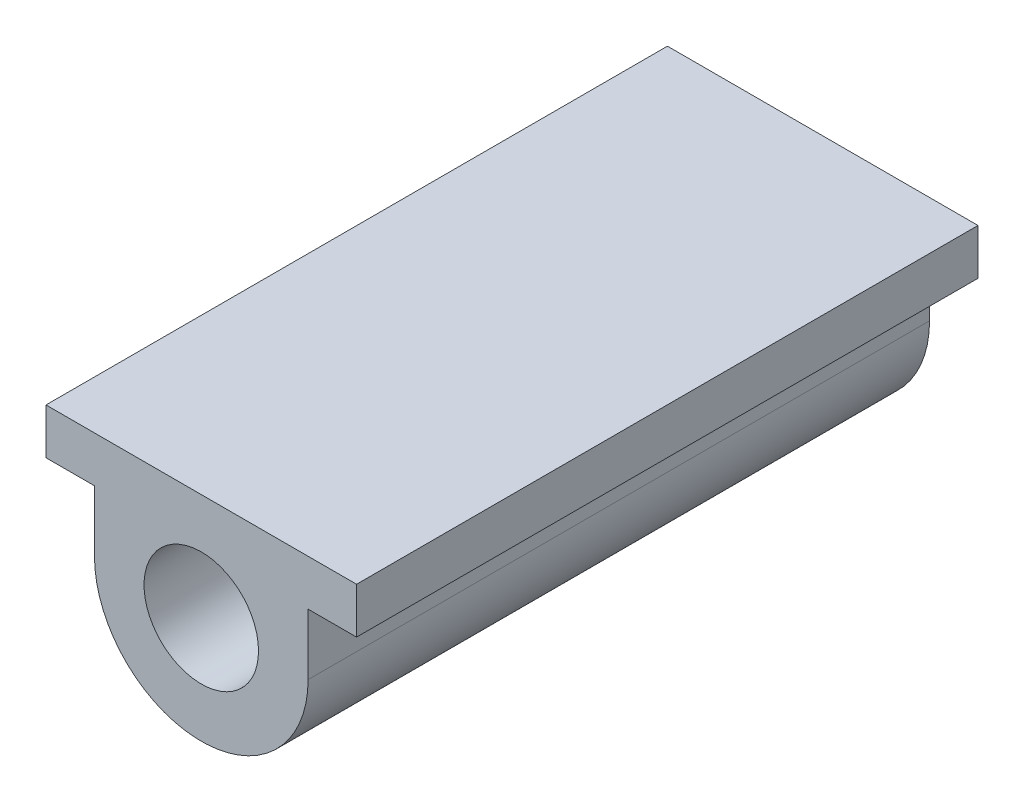
ISO-10303-21;
HEADER;
FILE_DESCRIPTION(('STEP AP214'),'2;1');
FILE_NAME('part.step','',(''),(''),'','','');
FILE_SCHEMA(('AUTOMOTIVE_DESIGN { 1 0 10303 214 1 1 1 1 }'));
ENDSEC;
DATA;
#1=APPLICATION_CONTEXT('core data for automotive mechanical design processes');
#2=APPLICATION_PROTOCOL_DEFINITION('international standard','automotive_design',2000,#1);
#3=PRODUCT_CONTEXT('',#1,'mechanical');
#4=PRODUCT('Part','Part','',(#3));
#5=PRODUCT_RELATED_PRODUCT_CATEGORY('part','',(#4));
#6=PRODUCT_DEFINITION_FORMATION('','',#4);
#7=PRODUCT_DEFINITION_CONTEXT('part definition',#1,'design');
#8=PRODUCT_DEFINITION('design','',#6,#7);
#9=PRODUCT_DEFINITION_SHAPE('','',#8);
#10=(LENGTH_UNIT() NAMED_UNIT(*) SI_UNIT(.MILLI.,.METRE.));
#11=(NAMED_UNIT(*) PLANE_ANGLE_UNIT() SI_UNIT($,.RADIAN.));
#12=(NAMED_UNIT(*) SI_UNIT($,.STERADIAN.) SOLID_ANGLE_UNIT());
#13=UNCERTAINTY_MEASURE_WITH_UNIT(LENGTH_MEASURE(1.E-05),#10,'distance_accuracy_value','');
#14=(GEOMETRIC_REPRESENTATION_CONTEXT(3) GLOBAL_UNCERTAINTY_ASSIGNED_CONTEXT((#13)) GLOBAL_UNIT_ASSIGNED_CONTEXT((#10,
#11,#12)) REPRESENTATION_CONTEXT('',''));
#15=CARTESIAN_POINT('',(0.,0.,0.));
#16=DIRECTION('',(0.,0.,1.));
#17=DIRECTION('',(1.,0.,0.));
#18=AXIS2_PLACEMENT_3D('',#15,#16,#17);
#19=CARTESIAN_POINT('',(0.,0.,81.44));
#20=DIRECTION('',(0.,0.,-1.));
#21=DIRECTION('',(-1.,0.,0.));
#22=AXIS2_PLACEMENT_3D('',#19,#20,#21);
#23=PLANE('',#22);
#24=DIRECTION('',(0.,-1.,0.));
#25=VECTOR('',#24,1.);
#26=CARTESIAN_POINT('',(-20.35,14.,81.44));
#27=LINE('',#26,#25);
#28=CARTESIAN_POINT('',(-20.35,14.,81.44));
#29=VERTEX_POINT('',#28);
#30=CARTESIAN_POINT('',(-20.35,8.,81.44));
#31=VERTEX_POINT('',#30);
#32=EDGE_CURVE('E147',#29,#31,#27,.T.);
#33=ORIENTED_EDGE('',*,*,#32,.T.);
#34=DIRECTION('',(1.,0.,0.));
#35=VECTOR('',#34,1.);
#36=CARTESIAN_POINT('',(-20.35,8.,81.44));
#37=LINE('',#36,#35);
#38=CARTESIAN_POINT('',(-14.,8.,81.44));
#39=VERTEX_POINT('',#38);
#40=EDGE_CURVE('E95',#31,#39,#37,.T.);
#41=ORIENTED_EDGE('',*,*,#40,.T.);
#42=DIRECTION('',(0.,-1.,0.));
#43=VECTOR('',#42,1.);
#44=CARTESIAN_POINT('',(-14.,8.,81.44));
#45=LINE('',#44,#43);
#46=CARTESIAN_POINT('',(-14.,0.,81.44));
#47=VERTEX_POINT('',#46);
#48=EDGE_CURVE('E162',#39,#47,#45,.T.);
#49=ORIENTED_EDGE('',*,*,#48,.T.);
#50=CARTESIAN_POINT('',(0.,0.,81.44));
#51=DIRECTION('',(0.,0.,1.));
#52=DIRECTION('',(-1.,0.,0.));
#53=AXIS2_PLACEMENT_3D('',#50,#51,#52);
#54=CIRCLE('',#53,14.);
#55=CARTESIAN_POINT('',(14.,0.,81.44));
#56=VERTEX_POINT('',#55);
#57=EDGE_CURVE('E175',#47,#56,#54,.T.);
#58=ORIENTED_EDGE('',*,*,#57,.T.);
#59=DIRECTION('',(0.,1.,0.));
#60=VECTOR('',#59,1.);
#61=CARTESIAN_POINT('',(14.,8.,81.44));
#62=LINE('',#61,#60);
#63=CARTESIAN_POINT('',(14.,8.,81.44));
#64=VERTEX_POINT('',#63);
#65=EDGE_CURVE('E114',#56,#64,#62,.T.);
#66=ORIENTED_EDGE('',*,*,#65,.T.);
#67=DIRECTION('',(1.,0.,0.));
#68=VECTOR('',#67,1.);
#69=CARTESIAN_POINT('',(20.35,8.,81.44));
#70=LINE('',#69,#68);
#71=CARTESIAN_POINT('',(20.35,8.,81.44));
#72=VERTEX_POINT('',#71);
#73=EDGE_CURVE('E108',#64,#72,#70,.T.);
#74=ORIENTED_EDGE('',*,*,#73,.T.);
#75=DIRECTION('',(0.,1.,0.));
#76=VECTOR('',#75,1.);
#77=CARTESIAN_POINT('',(20.35,14.,81.44));
#78=LINE('',#77,#76);
#79=CARTESIAN_POINT('',(20.35,14.,81.44));
#80=VERTEX_POINT('',#79);
#81=EDGE_CURVE('E112',#72,#80,#78,.T.);
#82=ORIENTED_EDGE('',*,*,#81,.T.);
#83=DIRECTION('',(-1.,0.,0.));
#84=VECTOR('',#83,1.);
#85=CARTESIAN_POINT('',(-20.35,14.,81.44));
#86=LINE('',#85,#84);
#87=EDGE_CURVE('E52',#80,#29,#86,.T.);
#88=ORIENTED_EDGE('',*,*,#87,.T.);
#89=EDGE_LOOP('',(#33,#41,#49,#58,#66,#74,#82,#88));
#90=FACE_BOUND('',#89,.T.);
#91=CARTESIAN_POINT('',(0.,0.,81.44));
#92=DIRECTION('',(0.,0.,1.));
#93=DIRECTION('',(1.,0.,0.));
#94=AXIS2_PLACEMENT_3D('',#91,#92,#93);
#95=CIRCLE('',#94,7.5);
#96=CARTESIAN_POINT('',(7.5,0.,81.44));
#97=VERTEX_POINT('',#96);
#98=EDGE_CURVE('E136',#97,#97,#95,.T.);
#99=ORIENTED_EDGE('',*,*,#98,.F.);
#100=EDGE_LOOP('',(#99));
#101=FACE_BOUND('',#100,.T.);
#102=ADVANCED_FACE('F35',(#90,#101),#23,.F.);
#103=CARTESIAN_POINT('',(0.,0.,0.));
#104=DIRECTION('',(0.,0.,-1.));
#105=DIRECTION('',(-1.,0.,0.));
#106=AXIS2_PLACEMENT_3D('',#103,#104,#105);
#107=PLANE('',#106);
#108=DIRECTION('',(0.,-1.,0.));
#109=VECTOR('',#108,1.);
#110=CARTESIAN_POINT('',(-20.35,14.,0.));
#111=LINE('',#110,#109);
#112=CARTESIAN_POINT('',(-20.35,14.,0.));
#113=VERTEX_POINT('',#112);
#114=CARTESIAN_POINT('',(-20.35,8.,0.));
#115=VERTEX_POINT('',#114);
#116=EDGE_CURVE('E132',#113,#115,#111,.T.);
#117=ORIENTED_EDGE('',*,*,#116,.F.);
#118=DIRECTION('',(-1.,0.,0.));
#119=VECTOR('',#118,1.);
#120=CARTESIAN_POINT('',(-20.35,14.,0.));
#121=LINE('',#120,#119);
#122=CARTESIAN_POINT('',(20.35,14.,0.));
#123=VERTEX_POINT('',#122);
#124=EDGE_CURVE('E87',#123,#113,#121,.T.);
#125=ORIENTED_EDGE('',*,*,#124,.F.);
#126=DIRECTION('',(0.,1.,0.));
#127=VECTOR('',#126,1.);
#128=CARTESIAN_POINT('',(20.35,14.,0.));
#129=LINE('',#128,#127);
#130=CARTESIAN_POINT('',(20.35,8.,0.));
#131=VERTEX_POINT('',#130);
#132=EDGE_CURVE('E81',#131,#123,#129,.T.);
#133=ORIENTED_EDGE('',*,*,#132,.F.);
#134=DIRECTION('',(1.,0.,0.));
#135=VECTOR('',#134,1.);
#136=CARTESIAN_POINT('',(20.35,8.,0.));
#137=LINE('',#136,#135);
#138=CARTESIAN_POINT('',(14.,8.,0.));
#139=VERTEX_POINT('',#138);
#140=EDGE_CURVE('E122',#139,#131,#137,.T.);
#141=ORIENTED_EDGE('',*,*,#140,.F.);
#142=DIRECTION('',(0.,1.,0.));
#143=VECTOR('',#142,1.);
#144=CARTESIAN_POINT('',(14.,8.,0.));
#145=LINE('',#144,#143);
#146=CARTESIAN_POINT('',(14.,0.,0.));
#147=VERTEX_POINT('',#146);
#148=EDGE_CURVE('E142',#147,#139,#145,.T.);
#149=ORIENTED_EDGE('',*,*,#148,.F.);
#150=CARTESIAN_POINT('',(0.,0.,0.));
#151=DIRECTION('',(0.,0.,1.));
#152=DIRECTION('',(-1.,0.,0.));
#153=AXIS2_PLACEMENT_3D('',#150,#151,#152);
#154=CIRCLE('',#153,14.);
#155=CARTESIAN_POINT('',(-14.,0.,0.));
#156=VERTEX_POINT('',#155);
#157=EDGE_CURVE('E140',#156,#147,#154,.T.);
#158=ORIENTED_EDGE('',*,*,#157,.F.);
#159=DIRECTION('',(0.,-1.,0.));
#160=VECTOR('',#159,1.);
#161=CARTESIAN_POINT('',(-14.,8.,0.));
#162=LINE('',#161,#160);
#163=CARTESIAN_POINT('',(-14.,8.,0.));
#164=VERTEX_POINT('',#163);
#165=EDGE_CURVE('E138',#164,#156,#162,.T.);
#166=ORIENTED_EDGE('',*,*,#165,.F.);
#167=DIRECTION('',(1.,0.,0.));
#168=VECTOR('',#167,1.);
#169=CARTESIAN_POINT('',(-20.35,8.,0.));
#170=LINE('',#169,#168);
#171=EDGE_CURVE('E135',#115,#164,#170,.T.);
#172=ORIENTED_EDGE('',*,*,#171,.F.);
#173=EDGE_LOOP('',(#117,#125,#133,#141,#149,#158,#166,#172));
#174=FACE_BOUND('',#173,.T.);
#175=CARTESIAN_POINT('',(0.,0.,0.));
#176=DIRECTION('',(0.,0.,1.));
#177=DIRECTION('',(1.,0.,0.));
#178=AXIS2_PLACEMENT_3D('',#175,#176,#177);
#179=CIRCLE('',#178,7.5);
#180=CARTESIAN_POINT('',(7.5,0.,0.));
#181=VERTEX_POINT('',#180);
#182=EDGE_CURVE('E181',#181,#181,#179,.T.);
#183=ORIENTED_EDGE('',*,*,#182,.T.);
#184=EDGE_LOOP('',(#183));
#185=FACE_BOUND('',#184,.T.);
#186=ADVANCED_FACE('F166',(#174,#185),#107,.T.);
#187=CARTESIAN_POINT('',(-20.35,14.,81.44));
#188=DIRECTION('',(1.,0.,0.));
#189=DIRECTION('',(0.,0.,-1.));
#190=AXIS2_PLACEMENT_3D('',#187,#188,#189);
#191=PLANE('',#190);
#192=ORIENTED_EDGE('',*,*,#116,.T.);
#193=DIRECTION('',(0.,0.,-1.));
#194=VECTOR('',#193,1.);
#195=CARTESIAN_POINT('',(-20.35,8.,81.44));
#196=LINE('',#195,#194);
#197=EDGE_CURVE('E11',#31,#115,#196,.T.);
#198=ORIENTED_EDGE('',*,*,#197,.F.);
#199=ORIENTED_EDGE('',*,*,#32,.F.);
#200=DIRECTION('',(0.,0.,-1.));
#201=VECTOR('',#200,1.);
#202=CARTESIAN_POINT('',(-20.35,14.,81.44));
#203=LINE('',#202,#201);
#204=EDGE_CURVE('E128',#29,#113,#203,.T.);
#205=ORIENTED_EDGE('',*,*,#204,.T.);
#206=EDGE_LOOP('',(#192,#198,#199,#205));
#207=FACE_BOUND('',#206,.T.);
#208=ADVANCED_FACE('F37',(#207),#191,.F.);
#209=CARTESIAN_POINT('',(-20.35,8.,81.44));
#210=DIRECTION('',(0.,1.,0.));
#211=DIRECTION('',(0.,0.,1.));
#212=AXIS2_PLACEMENT_3D('',#209,#210,#211);
#213=PLANE('',#212);
#214=ORIENTED_EDGE('',*,*,#171,.T.);
#215=DIRECTION('',(0.,0.,-1.));
#216=VECTOR('',#215,1.);
#217=CARTESIAN_POINT('',(-14.,8.,81.44));
#218=LINE('',#217,#216);
#219=EDGE_CURVE('E44',#39,#164,#218,.T.);
#220=ORIENTED_EDGE('',*,*,#219,.F.);
#221=ORIENTED_EDGE('',*,*,#40,.F.);
#222=ORIENTED_EDGE('',*,*,#197,.T.);
#223=EDGE_LOOP('',(#214,#220,#221,#222));
#224=FACE_BOUND('',#223,.T.);
#225=ADVANCED_FACE('F209',(#224),#213,.F.);
#226=CARTESIAN_POINT('',(-14.,8.,81.44));
#227=DIRECTION('',(1.,0.,0.));
#228=DIRECTION('',(0.,1.,0.));
#229=AXIS2_PLACEMENT_3D('',#226,#227,#228);
#230=PLANE('',#229);
#231=ORIENTED_EDGE('',*,*,#165,.T.);
#232=DIRECTION('',(0.,0.,-1.));
#233=VECTOR('',#232,1.);
#234=CARTESIAN_POINT('',(-14.,0.,81.44));
#235=LINE('',#234,#233);
#236=EDGE_CURVE('E154',#47,#156,#235,.T.);
#237=ORIENTED_EDGE('',*,*,#236,.F.);
#238=ORIENTED_EDGE('',*,*,#48,.F.);
#239=ORIENTED_EDGE('',*,*,#219,.T.);
#240=EDGE_LOOP('',(#231,#237,#238,#239));
#241=FACE_BOUND('',#240,.T.);
#242=ADVANCED_FACE('F160',(#241),#230,.F.);
#243=CARTESIAN_POINT('',(0.,0.,81.44));
#244=DIRECTION('',(0.,0.,-1.));
#245=DIRECTION('',(-1.,0.,0.));
#246=AXIS2_PLACEMENT_3D('',#243,#244,#245);
#247=CYLINDRICAL_SURFACE('',#246,14.);
#248=ORIENTED_EDGE('',*,*,#157,.T.);
#249=DIRECTION('',(0.,0.,-1.));
#250=VECTOR('',#249,1.);
#251=CARTESIAN_POINT('',(14.,0.,81.44));
#252=LINE('',#251,#250);
#253=EDGE_CURVE('E151',#56,#147,#252,.T.);
#254=ORIENTED_EDGE('',*,*,#253,.F.);
#255=ORIENTED_EDGE('',*,*,#57,.F.);
#256=ORIENTED_EDGE('',*,*,#236,.T.);
#257=EDGE_LOOP('',(#248,#254,#255,#256));
#258=FACE_BOUND('',#257,.T.);
#259=ADVANCED_FACE('F171',(#258),#247,.T.);
#260=CARTESIAN_POINT('',(14.,8.,81.44));
#261=DIRECTION('',(-1.,0.,0.));
#262=DIRECTION('',(0.,0.,1.));
#263=AXIS2_PLACEMENT_3D('',#260,#261,#262);
#264=PLANE('',#263);
#265=ORIENTED_EDGE('',*,*,#148,.T.);
#266=DIRECTION('',(0.,0.,-1.));
#267=VECTOR('',#266,1.);
#268=CARTESIAN_POINT('',(14.,8.,81.44));
#269=LINE('',#268,#267);
#270=EDGE_CURVE('E123',#64,#139,#269,.T.);
#271=ORIENTED_EDGE('',*,*,#270,.F.);
#272=ORIENTED_EDGE('',*,*,#65,.F.);
#273=ORIENTED_EDGE('',*,*,#253,.T.);
#274=EDGE_LOOP('',(#265,#271,#272,#273));
#275=FACE_BOUND('',#274,.T.);
#276=ADVANCED_FACE('F174',(#275),#264,.F.);
#277=CARTESIAN_POINT('',(20.35,8.,81.44));
#278=DIRECTION('',(0.,1.,0.));
#279=DIRECTION('',(0.,0.,1.));
#280=AXIS2_PLACEMENT_3D('',#277,#278,#279);
#281=PLANE('',#280);
#282=ORIENTED_EDGE('',*,*,#140,.T.);
#283=DIRECTION('',(0.,0.,-1.));
#284=VECTOR('',#283,1.);
#285=CARTESIAN_POINT('',(20.35,8.,81.44));
#286=LINE('',#285,#284);
#287=EDGE_CURVE('E119',#72,#131,#286,.T.);
#288=ORIENTED_EDGE('',*,*,#287,.F.);
#289=ORIENTED_EDGE('',*,*,#73,.F.);
#290=ORIENTED_EDGE('',*,*,#270,.T.);
#291=EDGE_LOOP('',(#282,#288,#289,#290));
#292=FACE_BOUND('',#291,.T.);
#293=ADVANCED_FACE('F120',(#292),#281,.F.);
#294=CARTESIAN_POINT('',(20.35,14.,81.44));
#295=DIRECTION('',(-1.,0.,0.));
#296=DIRECTION('',(0.,0.,1.));
#297=AXIS2_PLACEMENT_3D('',#294,#295,#296);
#298=PLANE('',#297);
#299=ORIENTED_EDGE('',*,*,#132,.T.);
#300=DIRECTION('',(0.,0.,-1.));
#301=VECTOR('',#300,1.);
#302=CARTESIAN_POINT('',(20.35,14.,81.44));
#303=LINE('',#302,#301);
#304=EDGE_CURVE('E124',#80,#123,#303,.T.);
#305=ORIENTED_EDGE('',*,*,#304,.F.);
#306=ORIENTED_EDGE('',*,*,#81,.F.);
#307=ORIENTED_EDGE('',*,*,#287,.T.);
#308=EDGE_LOOP('',(#299,#305,#306,#307));
#309=FACE_BOUND('',#308,.T.);
#310=ADVANCED_FACE('F126',(#309),#298,.F.);
#311=CARTESIAN_POINT('',(-20.35,14.,81.44));
#312=DIRECTION('',(0.,-1.,0.));
#313=DIRECTION('',(0.,0.,-1.));
#314=AXIS2_PLACEMENT_3D('',#311,#312,#313);
#315=PLANE('',#314);
#316=ORIENTED_EDGE('',*,*,#124,.T.);
#317=ORIENTED_EDGE('',*,*,#204,.F.);
#318=ORIENTED_EDGE('',*,*,#87,.F.);
#319=ORIENTED_EDGE('',*,*,#304,.T.);
#320=EDGE_LOOP('',(#316,#317,#318,#319));
#321=FACE_BOUND('',#320,.T.);
#322=ADVANCED_FACE('F197',(#321),#315,.F.);
#323=CARTESIAN_POINT('',(0.,0.,81.44));
#324=DIRECTION('',(0.,0.,-1.));
#325=DIRECTION('',(-1.,0.,0.));
#326=AXIS2_PLACEMENT_3D('',#323,#324,#325);
#327=CYLINDRICAL_SURFACE('',#326,7.5);
#328=ORIENTED_EDGE('',*,*,#98,.T.);
#329=EDGE_LOOP('',(#328));
#330=FACE_BOUND('',#329,.T.);
#331=ORIENTED_EDGE('',*,*,#182,.F.);
#332=EDGE_LOOP('',(#331));
#333=FACE_BOUND('',#332,.T.);
#334=ADVANCED_FACE('F187',(#330,#333),#327,.F.);
#335=CLOSED_SHELL('',(#102,#186,#208,#225,#242,#259,#276,#293,#310,#322,#334));
#336=MANIFOLD_SOLID_BREP('B2',#335);
#337=ADVANCED_BREP_SHAPE_REPRESENTATION('',(#18,#336),#14);
#338=SHAPE_DEFINITION_REPRESENTATION(#9,#337);
ENDSEC;
END-ISO-10303-21;
